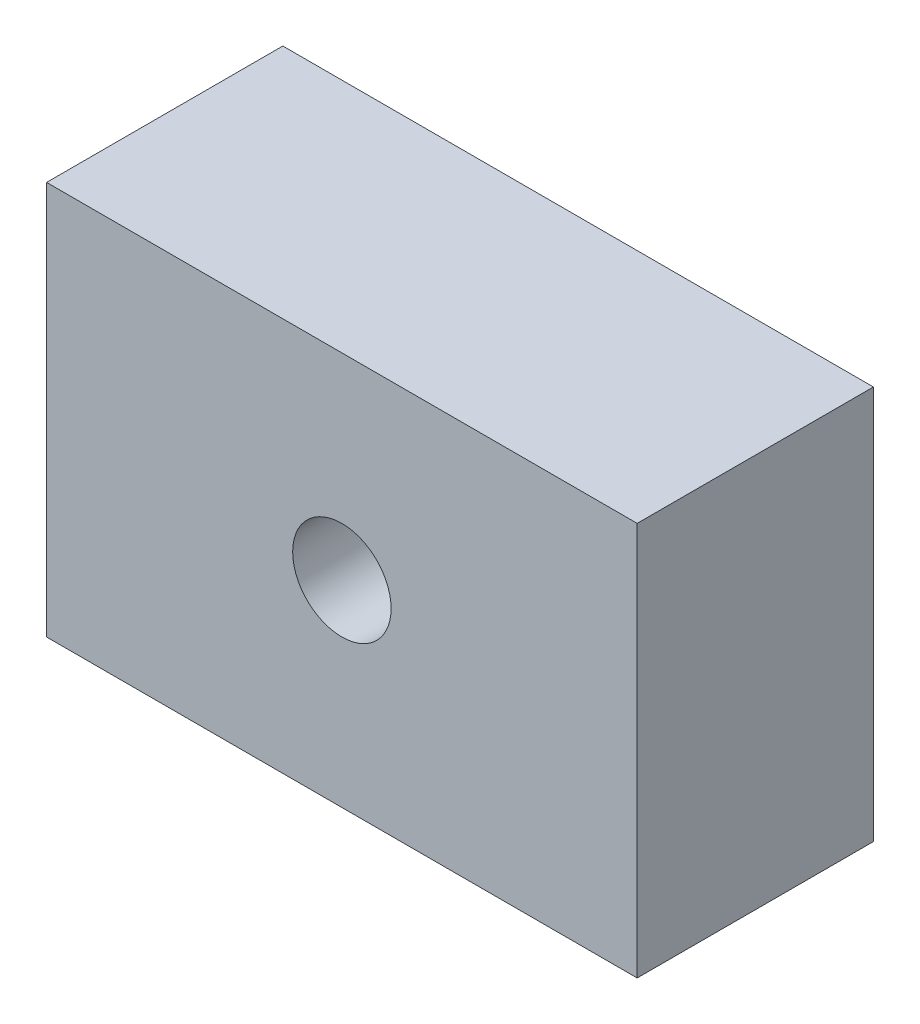
ISO-10303-21;
HEADER;
FILE_DESCRIPTION(('STEP AP214'),'2;1');
FILE_NAME('part.step','',(''),(''),'','','');
FILE_SCHEMA(('AUTOMOTIVE_DESIGN { 1 0 10303 214 1 1 1 1 }'));
ENDSEC;
DATA;
#1=APPLICATION_CONTEXT('core data for automotive mechanical design processes');
#2=APPLICATION_PROTOCOL_DEFINITION('international standard','automotive_design',2000,#1);
#3=PRODUCT_CONTEXT('',#1,'mechanical');
#4=PRODUCT('Part','Part','',(#3));
#5=PRODUCT_RELATED_PRODUCT_CATEGORY('part','',(#4));
#6=PRODUCT_DEFINITION_FORMATION('','',#4);
#7=PRODUCT_DEFINITION_CONTEXT('part definition',#1,'design');
#8=PRODUCT_DEFINITION('design','',#6,#7);
#9=PRODUCT_DEFINITION_SHAPE('','',#8);
#10=(LENGTH_UNIT() NAMED_UNIT(*) SI_UNIT(.MILLI.,.METRE.));
#11=(NAMED_UNIT(*) PLANE_ANGLE_UNIT() SI_UNIT($,.RADIAN.));
#12=(NAMED_UNIT(*) SI_UNIT($,.STERADIAN.) SOLID_ANGLE_UNIT());
#13=UNCERTAINTY_MEASURE_WITH_UNIT(LENGTH_MEASURE(1.E-05),#10,'distance_accuracy_value','');
#14=(GEOMETRIC_REPRESENTATION_CONTEXT(3) GLOBAL_UNCERTAINTY_ASSIGNED_CONTEXT((#13)) GLOBAL_UNIT_ASSIGNED_CONTEXT((#10,
#11,#12)) REPRESENTATION_CONTEXT('',''));
#15=CARTESIAN_POINT('',(0.,0.,0.));
#16=DIRECTION('',(0.,0.,1.));
#17=DIRECTION('',(1.,0.,0.));
#18=AXIS2_PLACEMENT_3D('',#15,#16,#17);
#19=CARTESIAN_POINT('',(15.,290.,-9.99795250723982));
#20=DIRECTION('',(-1.,0.,0.));
#21=DIRECTION('',(0.,0.,1.));
#22=AXIS2_PLACEMENT_3D('',#19,#20,#21);
#23=PLANE('',#22);
#24=DIRECTION('',(0.,-1.,0.));
#25=VECTOR('',#24,1.);
#26=CARTESIAN_POINT('',(15.,290.,2.00204749276018));
#27=LINE('',#26,#25);
#28=CARTESIAN_POINT('',(15.,290.,2.00204749276018));
#29=VERTEX_POINT('',#28);
#30=CARTESIAN_POINT('',(15.,270.,2.00204749276018));
#31=VERTEX_POINT('',#30);
#32=EDGE_CURVE('E99',#29,#31,#27,.T.);
#33=ORIENTED_EDGE('',*,*,#32,.T.);
#34=DIRECTION('',(0.,0.,1.));
#35=VECTOR('',#34,1.);
#36=CARTESIAN_POINT('',(15.,270.,-9.99795250723982));
#37=LINE('',#36,#35);
#38=CARTESIAN_POINT('',(15.,270.,-9.99795250723982));
#39=VERTEX_POINT('',#38);
#40=EDGE_CURVE('E11',#39,#31,#37,.T.);
#41=ORIENTED_EDGE('',*,*,#40,.F.);
#42=DIRECTION('',(0.,-1.,0.));
#43=VECTOR('',#42,1.);
#44=CARTESIAN_POINT('',(15.,290.,-9.99795250723982));
#45=LINE('',#44,#43);
#46=CARTESIAN_POINT('',(15.,290.,-9.99795250723982));
#47=VERTEX_POINT('',#46);
#48=EDGE_CURVE('E86',#47,#39,#45,.T.);
#49=ORIENTED_EDGE('',*,*,#48,.F.);
#50=DIRECTION('',(0.,0.,1.));
#51=VECTOR('',#50,1.);
#52=CARTESIAN_POINT('',(15.,290.,-9.99795250723982));
#53=LINE('',#52,#51);
#54=EDGE_CURVE('E95',#47,#29,#53,.T.);
#55=ORIENTED_EDGE('',*,*,#54,.T.);
#56=EDGE_LOOP('',(#33,#41,#49,#55));
#57=FACE_BOUND('',#56,.T.);
#58=ADVANCED_FACE('F34',(#57),#23,.F.);
#59=CARTESIAN_POINT('',(15.,270.,-9.99795250723982));
#60=DIRECTION('',(0.,1.,0.));
#61=DIRECTION('',(0.,0.,1.));
#62=AXIS2_PLACEMENT_3D('',#59,#60,#61);
#63=PLANE('',#62);
#64=DIRECTION('',(-1.,0.,0.));
#65=VECTOR('',#64,1.);
#66=CARTESIAN_POINT('',(15.,270.,2.00204749276018));
#67=LINE('',#66,#65);
#68=CARTESIAN_POINT('',(-15.,270.,2.00204749276018));
#69=VERTEX_POINT('',#68);
#70=EDGE_CURVE('E90',#31,#69,#67,.T.);
#71=ORIENTED_EDGE('',*,*,#70,.T.);
#72=DIRECTION('',(0.,0.,1.));
#73=VECTOR('',#72,1.);
#74=CARTESIAN_POINT('',(-15.,270.,-9.99795250723982));
#75=LINE('',#74,#73);
#76=CARTESIAN_POINT('',(-15.,270.,-9.99795250723982));
#77=VERTEX_POINT('',#76);
#78=EDGE_CURVE('E43',#77,#69,#75,.T.);
#79=ORIENTED_EDGE('',*,*,#78,.F.);
#80=DIRECTION('',(-1.,0.,0.));
#81=VECTOR('',#80,1.);
#82=CARTESIAN_POINT('',(15.,270.,-9.99795250723982));
#83=LINE('',#82,#81);
#84=EDGE_CURVE('E81',#39,#77,#83,.T.);
#85=ORIENTED_EDGE('',*,*,#84,.F.);
#86=ORIENTED_EDGE('',*,*,#40,.T.);
#87=EDGE_LOOP('',(#71,#79,#85,#86));
#88=FACE_BOUND('',#87,.T.);
#89=ADVANCED_FACE('F89',(#88),#63,.F.);
#90=CARTESIAN_POINT('',(-15.,290.,-9.99795250723982));
#91=DIRECTION('',(1.,0.,0.));
#92=DIRECTION('',(0.,0.,-1.));
#93=AXIS2_PLACEMENT_3D('',#90,#91,#92);
#94=PLANE('',#93);
#95=DIRECTION('',(0.,1.,0.));
#96=VECTOR('',#95,1.);
#97=CARTESIAN_POINT('',(-15.,290.,2.00204749276018));
#98=LINE('',#97,#96);
#99=CARTESIAN_POINT('',(-15.,290.,2.00204749276018));
#100=VERTEX_POINT('',#99);
#101=EDGE_CURVE('E68',#69,#100,#98,.T.);
#102=ORIENTED_EDGE('',*,*,#101,.T.);
#103=DIRECTION('',(0.,0.,1.));
#104=VECTOR('',#103,1.);
#105=CARTESIAN_POINT('',(-15.,290.,-9.99795250723982));
#106=LINE('',#105,#104);
#107=CARTESIAN_POINT('',(-15.,290.,-9.99795250723982));
#108=VERTEX_POINT('',#107);
#109=EDGE_CURVE('E91',#108,#100,#106,.T.);
#110=ORIENTED_EDGE('',*,*,#109,.F.);
#111=DIRECTION('',(0.,1.,0.));
#112=VECTOR('',#111,1.);
#113=CARTESIAN_POINT('',(-15.,290.,-9.99795250723982));
#114=LINE('',#113,#112);
#115=EDGE_CURVE('E84',#77,#108,#114,.T.);
#116=ORIENTED_EDGE('',*,*,#115,.F.);
#117=ORIENTED_EDGE('',*,*,#78,.T.);
#118=EDGE_LOOP('',(#102,#110,#116,#117));
#119=FACE_BOUND('',#118,.T.);
#120=ADVANCED_FACE('F93',(#119),#94,.F.);
#121=CARTESIAN_POINT('',(15.,290.,-9.99795250723982));
#122=DIRECTION('',(0.,-1.,0.));
#123=DIRECTION('',(0.,0.,-1.));
#124=AXIS2_PLACEMENT_3D('',#121,#122,#123);
#125=PLANE('',#124);
#126=DIRECTION('',(1.,0.,0.));
#127=VECTOR('',#126,1.);
#128=CARTESIAN_POINT('',(15.,290.,2.00204749276018));
#129=LINE('',#128,#127);
#130=EDGE_CURVE('E74',#100,#29,#129,.T.);
#131=ORIENTED_EDGE('',*,*,#130,.T.);
#132=ORIENTED_EDGE('',*,*,#54,.F.);
#133=DIRECTION('',(1.,0.,0.));
#134=VECTOR('',#133,1.);
#135=CARTESIAN_POINT('',(15.,290.,-9.99795250723982));
#136=LINE('',#135,#134);
#137=EDGE_CURVE('E51',#108,#47,#136,.T.);
#138=ORIENTED_EDGE('',*,*,#137,.F.);
#139=ORIENTED_EDGE('',*,*,#109,.T.);
#140=EDGE_LOOP('',(#131,#132,#138,#139));
#141=FACE_BOUND('',#140,.T.);
#142=ADVANCED_FACE('F106',(#141),#125,.F.);
#143=CARTESIAN_POINT('',(0.,0.,-9.99795250723982));
#144=DIRECTION('',(0.,0.,-1.));
#145=DIRECTION('',(-1.,0.,0.));
#146=AXIS2_PLACEMENT_3D('',#143,#144,#145);
#147=PLANE('',#146);
#148=CARTESIAN_POINT('',(0.,280.,-9.99795250723982));
#149=DIRECTION('',(0.,0.,1.));
#150=DIRECTION('',(1.,0.,0.));
#151=AXIS2_PLACEMENT_3D('',#148,#149,#150);
#152=CIRCLE('',#151,2.5);
#153=CARTESIAN_POINT('',(2.5,280.,-9.99795250723982));
#154=VERTEX_POINT('',#153);
#155=EDGE_CURVE('E112',#154,#154,#152,.T.);
#156=ORIENTED_EDGE('',*,*,#155,.T.);
#157=EDGE_LOOP('',(#156));
#158=FACE_BOUND('',#157,.T.);
#159=ORIENTED_EDGE('',*,*,#48,.T.);
#160=ORIENTED_EDGE('',*,*,#84,.T.);
#161=ORIENTED_EDGE('',*,*,#115,.T.);
#162=ORIENTED_EDGE('',*,*,#137,.T.);
#163=EDGE_LOOP('',(#159,#160,#161,#162));
#164=FACE_BOUND('',#163,.T.);
#165=ADVANCED_FACE('F82',(#158,#164),#147,.T.);
#166=CARTESIAN_POINT('',(0.,0.,2.00204749276018));
#167=DIRECTION('',(0.,0.,-1.));
#168=DIRECTION('',(-1.,0.,0.));
#169=AXIS2_PLACEMENT_3D('',#166,#167,#168);
#170=PLANE('',#169);
#171=CARTESIAN_POINT('',(0.,280.,2.00204749276018));
#172=DIRECTION('',(0.,0.,-1.));
#173=DIRECTION('',(-1.,0.,0.));
#174=AXIS2_PLACEMENT_3D('',#171,#172,#173);
#175=CIRCLE('',#174,2.5);
#176=CARTESIAN_POINT('',(-2.5,280.,2.00204749276018));
#177=VERTEX_POINT('',#176);
#178=EDGE_CURVE('E37',#177,#177,#175,.T.);
#179=ORIENTED_EDGE('',*,*,#178,.T.);
#180=EDGE_LOOP('',(#179));
#181=FACE_BOUND('',#180,.T.);
#182=ORIENTED_EDGE('',*,*,#32,.F.);
#183=ORIENTED_EDGE('',*,*,#130,.F.);
#184=ORIENTED_EDGE('',*,*,#101,.F.);
#185=ORIENTED_EDGE('',*,*,#70,.F.);
#186=EDGE_LOOP('',(#182,#183,#184,#185));
#187=FACE_BOUND('',#186,.T.);
#188=ADVANCED_FACE('F109',(#181,#187),#170,.F.);
#189=CARTESIAN_POINT('',(0.,280.,-9.99795250723982));
#190=DIRECTION('',(0.,0.,1.));
#191=DIRECTION('',(1.,0.,0.));
#192=AXIS2_PLACEMENT_3D('',#189,#190,#191);
#193=CYLINDRICAL_SURFACE('',#192,2.5);
#194=ORIENTED_EDGE('',*,*,#155,.F.);
#195=EDGE_LOOP('',(#194));
#196=FACE_BOUND('',#195,.T.);
#197=ORIENTED_EDGE('',*,*,#178,.F.);
#198=EDGE_LOOP('',(#197));
#199=FACE_BOUND('',#198,.T.);
#200=ADVANCED_FACE('F120',(#196,#199),#193,.F.);
#201=CLOSED_SHELL('',(#58,#89,#120,#142,#165,#188,#200));
#202=MANIFOLD_SOLID_BREP('B2',#201);
#203=ADVANCED_BREP_SHAPE_REPRESENTATION('',(#18,#202),#14);
#204=SHAPE_DEFINITION_REPRESENTATION(#9,#203);
ENDSEC;
END-ISO-10303-21;
